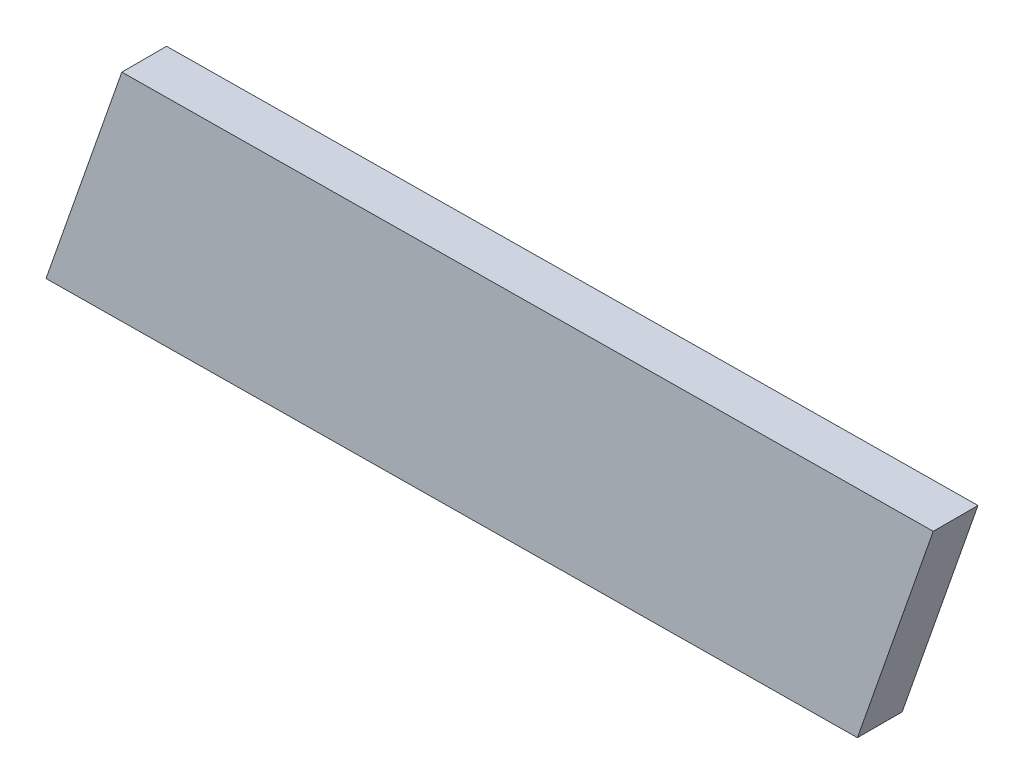
ISO-10303-21;
HEADER;
FILE_DESCRIPTION(('STEP AP214'),'2;1');
FILE_NAME('part.step','',(''),(''),'','','');
FILE_SCHEMA(('AUTOMOTIVE_DESIGN { 1 0 10303 214 1 1 1 1 }'));
ENDSEC;
DATA;
#1=APPLICATION_CONTEXT('core data for automotive mechanical design processes');
#2=APPLICATION_PROTOCOL_DEFINITION('international standard','automotive_design',2000,#1);
#3=PRODUCT_CONTEXT('',#1,'mechanical');
#4=PRODUCT('Part','Part','',(#3));
#5=PRODUCT_RELATED_PRODUCT_CATEGORY('part','',(#4));
#6=PRODUCT_DEFINITION_FORMATION('','',#4);
#7=PRODUCT_DEFINITION_CONTEXT('part definition',#1,'design');
#8=PRODUCT_DEFINITION('design','',#6,#7);
#9=PRODUCT_DEFINITION_SHAPE('','',#8);
#10=(LENGTH_UNIT() NAMED_UNIT(*) SI_UNIT(.MILLI.,.METRE.));
#11=(NAMED_UNIT(*) PLANE_ANGLE_UNIT() SI_UNIT($,.RADIAN.));
#12=(NAMED_UNIT(*) SI_UNIT($,.STERADIAN.) SOLID_ANGLE_UNIT());
#13=UNCERTAINTY_MEASURE_WITH_UNIT(LENGTH_MEASURE(1.E-05),#10,'distance_accuracy_value','');
#14=(GEOMETRIC_REPRESENTATION_CONTEXT(3) GLOBAL_UNCERTAINTY_ASSIGNED_CONTEXT((#13)) GLOBAL_UNIT_ASSIGNED_CONTEXT((#10,
#11,#12)) REPRESENTATION_CONTEXT('',''));
#15=CARTESIAN_POINT('',(0.,0.,0.));
#16=DIRECTION('',(0.,0.,1.));
#17=DIRECTION('',(1.,0.,0.));
#18=AXIS2_PLACEMENT_3D('',#15,#16,#17);
#19=CARTESIAN_POINT('',(-396.480550093671,-100.451262782976,-19.9253371305202));
#20=DIRECTION('',(0.,0.,1.));
#21=DIRECTION('',(1.,0.,0.));
#22=AXIS2_PLACEMENT_3D('',#19,#20,#21);
#23=PLANE('',#22);
#24=DIRECTION('',(0.,-1.,0.));
#25=VECTOR('',#24,1.);
#26=CARTESIAN_POINT('',(18.2047704018319,15.8676991552177,-19.9253371305202));
#27=LINE('',#26,#25);
#28=CARTESIAN_POINT('',(18.2047704018319,42.5285940980939,-19.9253371305202));
#29=VERTEX_POINT('',#28);
#30=CARTESIAN_POINT('',(18.2047704018319,15.8676991552177,-19.9253371305202));
#31=VERTEX_POINT('',#30);
#32=EDGE_CURVE('E234',#29,#31,#27,.T.);
#33=ORIENTED_EDGE('',*,*,#32,.F.);
#34=DIRECTION('',(1.,0.,0.));
#35=VECTOR('',#34,1.);
#36=CARTESIAN_POINT('',(18.2047704018319,42.5285940980939,-19.9253371305202));
#37=LINE('',#36,#35);
#38=CARTESIAN_POINT('',(-136.633504074103,42.5285940980939,-19.9253371305202));
#39=VERTEX_POINT('',#38);
#40=EDGE_CURVE('E224',#39,#29,#37,.T.);
#41=ORIENTED_EDGE('',*,*,#40,.F.);
#42=DIRECTION('',(0.,1.,0.));
#43=VECTOR('',#42,1.);
#44=CARTESIAN_POINT('',(-136.633504074103,15.8676991552177,-19.9253371305202));
#45=LINE('',#44,#43);
#46=CARTESIAN_POINT('',(-136.633504074103,15.8676991552177,-19.9253371305202));
#47=VERTEX_POINT('',#46);
#48=EDGE_CURVE('E227',#47,#39,#45,.T.);
#49=ORIENTED_EDGE('',*,*,#48,.F.);
#50=DIRECTION('',(-1.,0.,0.));
#51=VECTOR('',#50,1.);
#52=CARTESIAN_POINT('',(18.2047704018319,15.8676991552177,-19.9253371305202));
#53=LINE('',#52,#51);
#54=EDGE_CURVE('E231',#31,#47,#53,.T.);
#55=ORIENTED_EDGE('',*,*,#54,.F.);
#56=EDGE_LOOP('',(#33,#41,#49,#55));
#57=FACE_BOUND('',#56,.T.);
#58=DIRECTION('',(0.,-1.,0.));
#59=VECTOR('',#58,1.);
#60=CARTESIAN_POINT('',(478.617917684578,15.8676991552177,-19.9253371305202));
#61=LINE('',#60,#59);
#62=CARTESIAN_POINT('',(478.617917684578,42.5285940980939,-19.9253371305202));
#63=VERTEX_POINT('',#62);
#64=CARTESIAN_POINT('',(478.617917684578,15.8676991552177,-19.9253371305202));
#65=VERTEX_POINT('',#64);
#66=EDGE_CURVE('E270',#63,#65,#61,.T.);
#67=ORIENTED_EDGE('',*,*,#66,.F.);
#68=DIRECTION('',(1.,0.,0.));
#69=VECTOR('',#68,1.);
#70=CARTESIAN_POINT('',(478.617917684578,42.5285940980939,-19.9253371305202));
#71=LINE('',#70,#69);
#72=CARTESIAN_POINT('',(330.957576462495,42.5285940980939,-19.9253371305202));
#73=VERTEX_POINT('',#72);
#74=EDGE_CURVE('E282',#73,#63,#71,.T.);
#75=ORIENTED_EDGE('',*,*,#74,.F.);
#76=DIRECTION('',(0.,1.,0.));
#77=VECTOR('',#76,1.);
#78=CARTESIAN_POINT('',(330.957576462495,15.8676991552177,-19.9253371305202));
#79=LINE('',#78,#77);
#80=CARTESIAN_POINT('',(330.957576462495,15.8676991552177,-19.9253371305202));
#81=VERTEX_POINT('',#80);
#82=EDGE_CURVE('E294',#81,#73,#79,.T.);
#83=ORIENTED_EDGE('',*,*,#82,.F.);
#84=DIRECTION('',(-1.,0.,0.));
#85=VECTOR('',#84,1.);
#86=CARTESIAN_POINT('',(478.617917684578,15.8676991552177,-19.9253371305202));
#87=LINE('',#86,#85);
#88=EDGE_CURVE('E291',#65,#81,#87,.T.);
#89=ORIENTED_EDGE('',*,*,#88,.F.);
#90=EDGE_LOOP('',(#67,#75,#83,#89));
#91=FACE_BOUND('',#90,.T.);
#92=DIRECTION('',(0.999950891611865,0.00991031607147539,0.));
#93=VECTOR('',#92,1.);
#94=CARTESIAN_POINT('',(-396.480550093671,-100.451262782976,-19.9253371305202));
#95=LINE('',#94,#93);
#96=CARTESIAN_POINT('',(-396.480550093671,-100.451262782976,-19.9253371305202));
#97=VERTEX_POINT('',#96);
#98=CARTESIAN_POINT('',(510.183979551112,-91.4654894465558,-19.9253371305202));
#99=VERTEX_POINT('',#98);
#100=EDGE_CURVE('E310',#97,#99,#95,.T.);
#101=ORIENTED_EDGE('',*,*,#100,.F.);
#102=DIRECTION('',(-0.33029459913355,-0.943877893470976,0.));
#103=VECTOR('',#102,1.);
#104=CARTESIAN_POINT('',(-396.480550093671,-100.451262782976,-19.9253371305202));
#105=LINE('',#104,#103);
#106=CARTESIAN_POINT('',(-311.758231017663,141.658430409751,-19.9253371305202));
#107=VERTEX_POINT('',#106);
#108=EDGE_CURVE('E315',#107,#97,#105,.T.);
#109=ORIENTED_EDGE('',*,*,#108,.F.);
#110=DIRECTION('',(-0.999950891611865,-0.00991031607147539,0.));
#111=VECTOR('',#110,1.);
#112=CARTESIAN_POINT('',(-311.758231017663,141.658430409751,-19.9253371305202));
#113=LINE('',#112,#111);
#114=CARTESIAN_POINT('',(594.906298627121,150.644203746171,-19.9253371305202));
#115=VERTEX_POINT('',#114);
#116=EDGE_CURVE('E326',#115,#107,#113,.T.);
#117=ORIENTED_EDGE('',*,*,#116,.F.);
#118=DIRECTION('',(0.33029459913355,0.943877893470976,0.));
#119=VECTOR('',#118,1.);
#120=CARTESIAN_POINT('',(510.183979551112,-91.4654894465558,-19.9253371305202));
#121=LINE('',#120,#119);
#122=EDGE_CURVE('E324',#99,#115,#121,.T.);
#123=ORIENTED_EDGE('',*,*,#122,.F.);
#124=EDGE_LOOP('',(#101,#109,#117,#123));
#125=FACE_BOUND('',#124,.T.);
#126=DIRECTION('',(0.,-1.,0.));
#127=VECTOR('',#126,1.);
#128=CARTESIAN_POINT('',(246.873215488808,16.8931181914822,-19.9253371305202));
#129=LINE('',#128,#127);
#130=CARTESIAN_POINT('',(246.873215488808,43.5540131343584,-19.9253371305202));
#131=VERTEX_POINT('',#130);
#132=CARTESIAN_POINT('',(246.873215488808,16.8931181914822,-19.9253371305202));
#133=VERTEX_POINT('',#132);
#134=EDGE_CURVE('E267',#131,#133,#129,.T.);
#135=ORIENTED_EDGE('',*,*,#134,.F.);
#136=DIRECTION('',(1.,0.,0.));
#137=VECTOR('',#136,1.);
#138=CARTESIAN_POINT('',(246.873215488808,43.5540131343584,-19.9253371305202));
#139=LINE('',#138,#137);
#140=CARTESIAN_POINT('',(98.1874552304604,43.5540131343584,-19.9253371305202));
#141=VERTEX_POINT('',#140);
#142=EDGE_CURVE('E257',#141,#131,#139,.T.);
#143=ORIENTED_EDGE('',*,*,#142,.F.);
#144=DIRECTION('',(0.,1.,0.));
#145=VECTOR('',#144,1.);
#146=CARTESIAN_POINT('',(98.1874552304604,16.8931181914822,-19.9253371305202));
#147=LINE('',#146,#145);
#148=CARTESIAN_POINT('',(98.1874552304604,16.8931181914822,-19.9253371305202));
#149=VERTEX_POINT('',#148);
#150=EDGE_CURVE('E260',#149,#141,#147,.T.);
#151=ORIENTED_EDGE('',*,*,#150,.F.);
#152=DIRECTION('',(-1.,0.,0.));
#153=VECTOR('',#152,1.);
#154=CARTESIAN_POINT('',(246.873215488808,16.8931181914822,-19.9253371305202));
#155=LINE('',#154,#153);
#156=EDGE_CURVE('E264',#133,#149,#155,.T.);
#157=ORIENTED_EDGE('',*,*,#156,.F.);
#158=EDGE_LOOP('',(#135,#143,#151,#157));
#159=FACE_BOUND('',#158,.T.);
#160=DIRECTION('',(0.,-1.,0.));
#161=VECTOR('',#160,1.);
#162=CARTESIAN_POINT('',(-181.751941669739,16.8931181914822,-19.9253371305202));
#163=LINE('',#162,#161);
#164=CARTESIAN_POINT('',(-181.751941669739,43.5540131343584,-19.9253371305202));
#165=VERTEX_POINT('',#164);
#166=CARTESIAN_POINT('',(-181.751941669739,16.8931181914822,-19.9253371305202));
#167=VERTEX_POINT('',#166);
#168=EDGE_CURVE('E177',#165,#167,#163,.T.);
#169=ORIENTED_EDGE('',*,*,#168,.F.);
#170=DIRECTION('',(1.,0.,0.));
#171=VECTOR('',#170,1.);
#172=CARTESIAN_POINT('',(-181.751941669739,43.5540131343584,-19.9253371305202));
#173=LINE('',#172,#171);
#174=CARTESIAN_POINT('',(-316.081835420385,43.5540131343584,-19.9253371305202));
#175=VERTEX_POINT('',#174);
#176=EDGE_CURVE('E179',#175,#165,#173,.T.);
#177=ORIENTED_EDGE('',*,*,#176,.F.);
#178=DIRECTION('',(0.,1.,0.));
#179=VECTOR('',#178,1.);
#180=CARTESIAN_POINT('',(-316.081835420385,16.8931181914822,-19.9253371305202));
#181=LINE('',#180,#179);
#182=CARTESIAN_POINT('',(-316.081835420385,16.8931181914822,-19.9253371305202));
#183=VERTEX_POINT('',#182);
#184=EDGE_CURVE('E64',#183,#175,#181,.T.);
#185=ORIENTED_EDGE('',*,*,#184,.F.);
#186=DIRECTION('',(-1.,0.,0.));
#187=VECTOR('',#186,1.);
#188=CARTESIAN_POINT('',(-181.751941669739,16.8931181914822,-19.9253371305202));
#189=LINE('',#188,#187);
#190=EDGE_CURVE('E59',#167,#183,#189,.T.);
#191=ORIENTED_EDGE('',*,*,#190,.F.);
#192=EDGE_LOOP('',(#169,#177,#185,#191));
#193=FACE_BOUND('',#192,.T.);
#194=ADVANCED_FACE('F44',(#57,#91,#125,#159,#193),#23,.F.);
#195=CARTESIAN_POINT('',(-396.480550093671,-100.451262782976,30.0746628694798));
#196=DIRECTION('',(-0.00991031607147539,0.999950891611865,0.));
#197=DIRECTION('',(-0.999950891611865,-0.00991031607147539,0.));
#198=AXIS2_PLACEMENT_3D('',#195,#196,#197);
#199=PLANE('',#198);
#200=ORIENTED_EDGE('',*,*,#100,.T.);
#201=DIRECTION('',(0.,0.,-1.));
#202=VECTOR('',#201,1.);
#203=CARTESIAN_POINT('',(510.183979551112,-91.4654894465558,30.0746628694798));
#204=LINE('',#203,#202);
#205=CARTESIAN_POINT('',(510.183979551112,-91.4654894465558,30.0746628694798));
#206=VERTEX_POINT('',#205);
#207=EDGE_CURVE('E11',#206,#99,#204,.T.);
#208=ORIENTED_EDGE('',*,*,#207,.F.);
#209=DIRECTION('',(0.999950891611865,0.00991031607147539,0.));
#210=VECTOR('',#209,1.);
#211=CARTESIAN_POINT('',(-396.480550093671,-100.451262782976,30.0746628694798));
#212=LINE('',#211,#210);
#213=CARTESIAN_POINT('',(-396.480550093671,-100.451262782976,30.0746628694798));
#214=VERTEX_POINT('',#213);
#215=EDGE_CURVE('E311',#214,#206,#212,.T.);
#216=ORIENTED_EDGE('',*,*,#215,.F.);
#217=DIRECTION('',(0.,0.,-1.));
#218=VECTOR('',#217,1.);
#219=CARTESIAN_POINT('',(-396.480550093671,-100.451262782976,30.0746628694798));
#220=LINE('',#219,#218);
#221=EDGE_CURVE('E321',#214,#97,#220,.T.);
#222=ORIENTED_EDGE('',*,*,#221,.T.);
#223=EDGE_LOOP('',(#200,#208,#216,#222));
#224=FACE_BOUND('',#223,.T.);
#225=ADVANCED_FACE('F46',(#224),#199,.F.);
#226=CARTESIAN_POINT('',(510.183979551112,-91.4654894465558,30.0746628694798));
#227=DIRECTION('',(-0.943877893470976,0.33029459913355,0.));
#228=DIRECTION('',(-0.33029459913355,-0.943877893470977,0.));
#229=AXIS2_PLACEMENT_3D('',#226,#227,#228);
#230=PLANE('',#229);
#231=ORIENTED_EDGE('',*,*,#122,.T.);
#232=DIRECTION('',(0.,0.,-1.));
#233=VECTOR('',#232,1.);
#234=CARTESIAN_POINT('',(594.906298627121,150.644203746171,30.0746628694798));
#235=LINE('',#234,#233);
#236=CARTESIAN_POINT('',(594.906298627121,150.644203746171,30.0746628694798));
#237=VERTEX_POINT('',#236);
#238=EDGE_CURVE('E52',#237,#115,#235,.T.);
#239=ORIENTED_EDGE('',*,*,#238,.F.);
#240=DIRECTION('',(0.33029459913355,0.943877893470976,0.));
#241=VECTOR('',#240,1.);
#242=CARTESIAN_POINT('',(510.183979551112,-91.4654894465558,30.0746628694798));
#243=LINE('',#242,#241);
#244=EDGE_CURVE('E314',#206,#237,#243,.T.);
#245=ORIENTED_EDGE('',*,*,#244,.F.);
#246=ORIENTED_EDGE('',*,*,#207,.T.);
#247=EDGE_LOOP('',(#231,#239,#245,#246));
#248=FACE_BOUND('',#247,.T.);
#249=ADVANCED_FACE('F354',(#248),#230,.F.);
#250=CARTESIAN_POINT('',(-311.758231017663,141.658430409751,30.0746628694798));
#251=DIRECTION('',(0.00991031607147539,-0.999950891611865,0.));
#252=DIRECTION('',(0.999950891611865,0.00991031607147539,0.));
#253=AXIS2_PLACEMENT_3D('',#250,#251,#252);
#254=PLANE('',#253);
#255=ORIENTED_EDGE('',*,*,#116,.T.);
#256=DIRECTION('',(0.,0.,-1.));
#257=VECTOR('',#256,1.);
#258=CARTESIAN_POINT('',(-311.758231017663,141.658430409751,30.0746628694798));
#259=LINE('',#258,#257);
#260=CARTESIAN_POINT('',(-311.758231017663,141.658430409751,30.0746628694798));
#261=VERTEX_POINT('',#260);
#262=EDGE_CURVE('E331',#261,#107,#259,.T.);
#263=ORIENTED_EDGE('',*,*,#262,.F.);
#264=DIRECTION('',(-0.999950891611865,-0.00991031607147539,0.));
#265=VECTOR('',#264,1.);
#266=CARTESIAN_POINT('',(-311.758231017663,141.658430409751,30.0746628694798));
#267=LINE('',#266,#265);
#268=EDGE_CURVE('E317',#237,#261,#267,.T.);
#269=ORIENTED_EDGE('',*,*,#268,.F.);
#270=ORIENTED_EDGE('',*,*,#238,.T.);
#271=EDGE_LOOP('',(#255,#263,#269,#270));
#272=FACE_BOUND('',#271,.T.);
#273=ADVANCED_FACE('F338',(#272),#254,.F.);
#274=CARTESIAN_POINT('',(-396.480550093671,-100.451262782976,30.0746628694798));
#275=DIRECTION('',(0.943877893470976,-0.33029459913355,0.));
#276=DIRECTION('',(0.33029459913355,0.943877893470977,0.));
#277=AXIS2_PLACEMENT_3D('',#274,#275,#276);
#278=PLANE('',#277);
#279=ORIENTED_EDGE('',*,*,#108,.T.);
#280=ORIENTED_EDGE('',*,*,#221,.F.);
#281=DIRECTION('',(-0.33029459913355,-0.943877893470976,0.));
#282=VECTOR('',#281,1.);
#283=CARTESIAN_POINT('',(-396.480550093671,-100.451262782976,30.0746628694798));
#284=LINE('',#283,#282);
#285=EDGE_CURVE('E319',#261,#214,#284,.T.);
#286=ORIENTED_EDGE('',*,*,#285,.F.);
#287=ORIENTED_EDGE('',*,*,#262,.T.);
#288=EDGE_LOOP('',(#279,#280,#286,#287));
#289=FACE_BOUND('',#288,.T.);
#290=ADVANCED_FACE('F347',(#289),#278,.F.);
#291=CARTESIAN_POINT('',(-396.480550093671,-100.451262782976,30.0746628694798));
#292=DIRECTION('',(0.,0.,1.));
#293=DIRECTION('',(1.,0.,0.));
#294=AXIS2_PLACEMENT_3D('',#291,#292,#293);
#295=PLANE('',#294);
#296=ORIENTED_EDGE('',*,*,#215,.T.);
#297=ORIENTED_EDGE('',*,*,#244,.T.);
#298=ORIENTED_EDGE('',*,*,#268,.T.);
#299=ORIENTED_EDGE('',*,*,#285,.T.);
#300=EDGE_LOOP('',(#296,#297,#298,#299));
#301=FACE_BOUND('',#300,.T.);
#302=ADVANCED_FACE('F353',(#301),#295,.T.);
#303=CARTESIAN_POINT('',(478.617917684578,15.8676991552177,-22.4253371305202));
#304=DIRECTION('',(-1.,0.,0.));
#305=DIRECTION('',(0.,0.,1.));
#306=AXIS2_PLACEMENT_3D('',#303,#304,#305);
#307=PLANE('',#306);
#308=ORIENTED_EDGE('',*,*,#66,.T.);
#309=DIRECTION('',(0.,0.,1.));
#310=VECTOR('',#309,1.);
#311=CARTESIAN_POINT('',(478.617917684578,15.8676991552177,-22.4253371305202));
#312=LINE('',#311,#310);
#313=CARTESIAN_POINT('',(478.617917684578,15.8676991552177,-22.4253371305202));
#314=VERTEX_POINT('',#313);
#315=EDGE_CURVE('E307',#314,#65,#312,.T.);
#316=ORIENTED_EDGE('',*,*,#315,.F.);
#317=DIRECTION('',(0.,-1.,0.));
#318=VECTOR('',#317,1.);
#319=CARTESIAN_POINT('',(478.617917684578,15.8676991552177,-22.4253371305202));
#320=LINE('',#319,#318);
#321=CARTESIAN_POINT('',(478.617917684578,42.5285940980939,-22.4253371305202));
#322=VERTEX_POINT('',#321);
#323=EDGE_CURVE('E278',#322,#314,#320,.T.);
#324=ORIENTED_EDGE('',*,*,#323,.F.);
#325=DIRECTION('',(0.,0.,1.));
#326=VECTOR('',#325,1.);
#327=CARTESIAN_POINT('',(478.617917684578,42.5285940980939,-22.4253371305202));
#328=LINE('',#327,#326);
#329=EDGE_CURVE('E288',#322,#63,#328,.T.);
#330=ORIENTED_EDGE('',*,*,#329,.T.);
#331=EDGE_LOOP('',(#308,#316,#324,#330));
#332=FACE_BOUND('',#331,.T.);
#333=ADVANCED_FACE('F374',(#332),#307,.F.);
#334=CARTESIAN_POINT('',(478.617917684578,15.8676991552177,-22.4253371305202));
#335=DIRECTION('',(0.,1.,0.));
#336=DIRECTION('',(0.,0.,1.));
#337=AXIS2_PLACEMENT_3D('',#334,#335,#336);
#338=PLANE('',#337);
#339=ORIENTED_EDGE('',*,*,#88,.T.);
#340=DIRECTION('',(0.,0.,1.));
#341=VECTOR('',#340,1.);
#342=CARTESIAN_POINT('',(330.957576462495,15.8676991552177,-22.4253371305202));
#343=LINE('',#342,#341);
#344=CARTESIAN_POINT('',(330.957576462495,15.8676991552177,-22.4253371305202));
#345=VERTEX_POINT('',#344);
#346=EDGE_CURVE('E304',#345,#81,#343,.T.);
#347=ORIENTED_EDGE('',*,*,#346,.F.);
#348=DIRECTION('',(-1.,0.,0.));
#349=VECTOR('',#348,1.);
#350=CARTESIAN_POINT('',(478.617917684578,15.8676991552177,-22.4253371305202));
#351=LINE('',#350,#349);
#352=EDGE_CURVE('E281',#314,#345,#351,.T.);
#353=ORIENTED_EDGE('',*,*,#352,.F.);
#354=ORIENTED_EDGE('',*,*,#315,.T.);
#355=EDGE_LOOP('',(#339,#347,#353,#354));
#356=FACE_BOUND('',#355,.T.);
#357=ADVANCED_FACE('F378',(#356),#338,.F.);
#358=CARTESIAN_POINT('',(330.957576462495,15.8676991552177,-22.4253371305202));
#359=DIRECTION('',(1.,0.,0.));
#360=DIRECTION('',(0.,0.,-1.));
#361=AXIS2_PLACEMENT_3D('',#358,#359,#360);
#362=PLANE('',#361);
#363=ORIENTED_EDGE('',*,*,#82,.T.);
#364=DIRECTION('',(0.,0.,1.));
#365=VECTOR('',#364,1.);
#366=CARTESIAN_POINT('',(330.957576462495,42.5285940980939,-22.4253371305202));
#367=LINE('',#366,#365);
#368=CARTESIAN_POINT('',(330.957576462495,42.5285940980939,-22.4253371305202));
#369=VERTEX_POINT('',#368);
#370=EDGE_CURVE('E301',#369,#73,#367,.T.);
#371=ORIENTED_EDGE('',*,*,#370,.F.);
#372=DIRECTION('',(0.,1.,0.));
#373=VECTOR('',#372,1.);
#374=CARTESIAN_POINT('',(330.957576462495,15.8676991552177,-22.4253371305202));
#375=LINE('',#374,#373);
#376=EDGE_CURVE('E284',#345,#369,#375,.T.);
#377=ORIENTED_EDGE('',*,*,#376,.F.);
#378=ORIENTED_EDGE('',*,*,#346,.T.);
#379=EDGE_LOOP('',(#363,#371,#377,#378));
#380=FACE_BOUND('',#379,.T.);
#381=ADVANCED_FACE('F384',(#380),#362,.F.);
#382=CARTESIAN_POINT('',(478.617917684578,42.5285940980939,-22.4253371305202));
#383=DIRECTION('',(0.,-1.,0.));
#384=DIRECTION('',(0.,0.,-1.));
#385=AXIS2_PLACEMENT_3D('',#382,#383,#384);
#386=PLANE('',#385);
#387=ORIENTED_EDGE('',*,*,#74,.T.);
#388=ORIENTED_EDGE('',*,*,#329,.F.);
#389=DIRECTION('',(1.,0.,0.));
#390=VECTOR('',#389,1.);
#391=CARTESIAN_POINT('',(478.617917684578,42.5285940980939,-22.4253371305202));
#392=LINE('',#391,#390);
#393=EDGE_CURVE('E286',#369,#322,#392,.T.);
#394=ORIENTED_EDGE('',*,*,#393,.F.);
#395=ORIENTED_EDGE('',*,*,#370,.T.);
#396=EDGE_LOOP('',(#387,#388,#394,#395));
#397=FACE_BOUND('',#396,.T.);
#398=ADVANCED_FACE('F390',(#397),#386,.F.);
#399=CARTESIAN_POINT('',(-396.480550093671,-100.451262782976,-22.4253371305202));
#400=DIRECTION('',(0.,0.,1.));
#401=DIRECTION('',(1.,0.,0.));
#402=AXIS2_PLACEMENT_3D('',#399,#400,#401);
#403=PLANE('',#402);
#404=ORIENTED_EDGE('',*,*,#323,.T.);
#405=ORIENTED_EDGE('',*,*,#352,.T.);
#406=ORIENTED_EDGE('',*,*,#376,.T.);
#407=ORIENTED_EDGE('',*,*,#393,.T.);
#408=EDGE_LOOP('',(#404,#405,#406,#407));
#409=FACE_BOUND('',#408,.T.);
#410=ADVANCED_FACE('F394',(#409),#403,.F.);
#411=CARTESIAN_POINT('',(246.873215488808,16.8931181914822,-22.4253371305202));
#412=DIRECTION('',(-1.,0.,0.));
#413=DIRECTION('',(0.,0.,1.));
#414=AXIS2_PLACEMENT_3D('',#411,#412,#413);
#415=PLANE('',#414);
#416=ORIENTED_EDGE('',*,*,#134,.T.);
#417=DIRECTION('',(0.,0.,1.));
#418=VECTOR('',#417,1.);
#419=CARTESIAN_POINT('',(246.873215488808,16.8931181914822,-22.4253371305202));
#420=LINE('',#419,#418);
#421=CARTESIAN_POINT('',(246.873215488808,16.8931181914822,-22.4253371305202));
#422=VERTEX_POINT('',#421);
#423=EDGE_CURVE('E237',#422,#133,#420,.T.);
#424=ORIENTED_EDGE('',*,*,#423,.F.);
#425=DIRECTION('',(0.,-1.,0.));
#426=VECTOR('',#425,1.);
#427=CARTESIAN_POINT('',(246.873215488808,16.8931181914822,-22.4253371305202));
#428=LINE('',#427,#426);
#429=CARTESIAN_POINT('',(246.873215488808,43.5540131343584,-22.4253371305202));
#430=VERTEX_POINT('',#429);
#431=EDGE_CURVE('E261',#430,#422,#428,.T.);
#432=ORIENTED_EDGE('',*,*,#431,.F.);
#433=DIRECTION('',(0.,0.,1.));
#434=VECTOR('',#433,1.);
#435=CARTESIAN_POINT('',(246.873215488808,43.5540131343584,-22.4253371305202));
#436=LINE('',#435,#434);
#437=EDGE_CURVE('E253',#430,#131,#436,.T.);
#438=ORIENTED_EDGE('',*,*,#437,.T.);
#439=EDGE_LOOP('',(#416,#424,#432,#438));
#440=FACE_BOUND('',#439,.T.);
#441=ADVANCED_FACE('F398',(#440),#415,.F.);
#442=CARTESIAN_POINT('',(246.873215488808,16.8931181914822,-22.4253371305202));
#443=DIRECTION('',(0.,1.,0.));
#444=DIRECTION('',(0.,0.,1.));
#445=AXIS2_PLACEMENT_3D('',#442,#443,#444);
#446=PLANE('',#445);
#447=ORIENTED_EDGE('',*,*,#156,.T.);
#448=DIRECTION('',(0.,0.,1.));
#449=VECTOR('',#448,1.);
#450=CARTESIAN_POINT('',(98.1874552304604,16.8931181914822,-22.4253371305202));
#451=LINE('',#450,#449);
#452=CARTESIAN_POINT('',(98.1874552304604,16.8931181914822,-22.4253371305202));
#453=VERTEX_POINT('',#452);
#454=EDGE_CURVE('E247',#453,#149,#451,.T.);
#455=ORIENTED_EDGE('',*,*,#454,.F.);
#456=DIRECTION('',(-1.,0.,0.));
#457=VECTOR('',#456,1.);
#458=CARTESIAN_POINT('',(246.873215488808,16.8931181914822,-22.4253371305202));
#459=LINE('',#458,#457);
#460=EDGE_CURVE('E274',#422,#453,#459,.T.);
#461=ORIENTED_EDGE('',*,*,#460,.F.);
#462=ORIENTED_EDGE('',*,*,#423,.T.);
#463=EDGE_LOOP('',(#447,#455,#461,#462));
#464=FACE_BOUND('',#463,.T.);
#465=ADVANCED_FACE('F412',(#464),#446,.F.);
#466=CARTESIAN_POINT('',(98.1874552304604,16.8931181914822,-22.4253371305202));
#467=DIRECTION('',(1.,0.,0.));
#468=DIRECTION('',(0.,0.,-1.));
#469=AXIS2_PLACEMENT_3D('',#466,#467,#468);
#470=PLANE('',#469);
#471=ORIENTED_EDGE('',*,*,#150,.T.);
#472=DIRECTION('',(0.,0.,1.));
#473=VECTOR('',#472,1.);
#474=CARTESIAN_POINT('',(98.1874552304604,43.5540131343584,-22.4253371305202));
#475=LINE('',#474,#473);
#476=CARTESIAN_POINT('',(98.1874552304604,43.5540131343584,-22.4253371305202));
#477=VERTEX_POINT('',#476);
#478=EDGE_CURVE('E250',#477,#141,#475,.T.);
#479=ORIENTED_EDGE('',*,*,#478,.F.);
#480=DIRECTION('',(0.,1.,0.));
#481=VECTOR('',#480,1.);
#482=CARTESIAN_POINT('',(98.1874552304604,16.8931181914822,-22.4253371305202));
#483=LINE('',#482,#481);
#484=EDGE_CURVE('E272',#453,#477,#483,.T.);
#485=ORIENTED_EDGE('',*,*,#484,.F.);
#486=ORIENTED_EDGE('',*,*,#454,.T.);
#487=EDGE_LOOP('',(#471,#479,#485,#486));
#488=FACE_BOUND('',#487,.T.);
#489=ADVANCED_FACE('F408',(#488),#470,.F.);
#490=CARTESIAN_POINT('',(246.873215488808,43.5540131343584,-22.4253371305202));
#491=DIRECTION('',(0.,-1.,0.));
#492=DIRECTION('',(0.,0.,-1.));
#493=AXIS2_PLACEMENT_3D('',#490,#491,#492);
#494=PLANE('',#493);
#495=ORIENTED_EDGE('',*,*,#142,.T.);
#496=ORIENTED_EDGE('',*,*,#437,.F.);
#497=DIRECTION('',(1.,0.,0.));
#498=VECTOR('',#497,1.);
#499=CARTESIAN_POINT('',(246.873215488808,43.5540131343584,-22.4253371305202));
#500=LINE('',#499,#498);
#501=EDGE_CURVE('E256',#477,#430,#500,.T.);
#502=ORIENTED_EDGE('',*,*,#501,.F.);
#503=ORIENTED_EDGE('',*,*,#478,.T.);
#504=EDGE_LOOP('',(#495,#496,#502,#503));
#505=FACE_BOUND('',#504,.T.);
#506=ADVANCED_FACE('F404',(#505),#494,.F.);
#507=CARTESIAN_POINT('',(-396.480550093671,-100.451262782976,-22.4253371305202));
#508=DIRECTION('',(0.,0.,1.));
#509=DIRECTION('',(1.,0.,0.));
#510=AXIS2_PLACEMENT_3D('',#507,#508,#509);
#511=PLANE('',#510);
#512=ORIENTED_EDGE('',*,*,#431,.T.);
#513=ORIENTED_EDGE('',*,*,#460,.T.);
#514=ORIENTED_EDGE('',*,*,#484,.T.);
#515=ORIENTED_EDGE('',*,*,#501,.T.);
#516=EDGE_LOOP('',(#512,#513,#514,#515));
#517=FACE_BOUND('',#516,.T.);
#518=ADVANCED_FACE('F400',(#517),#511,.F.);
#519=CARTESIAN_POINT('',(18.2047704018319,15.8676991552177,-22.4253371305202));
#520=DIRECTION('',(-1.,0.,0.));
#521=DIRECTION('',(0.,0.,1.));
#522=AXIS2_PLACEMENT_3D('',#519,#520,#521);
#523=PLANE('',#522);
#524=ORIENTED_EDGE('',*,*,#32,.T.);
#525=DIRECTION('',(0.,0.,1.));
#526=VECTOR('',#525,1.);
#527=CARTESIAN_POINT('',(18.2047704018319,15.8676991552177,-22.4253371305202));
#528=LINE('',#527,#526);
#529=CARTESIAN_POINT('',(18.2047704018319,15.8676991552177,-22.4253371305202));
#530=VERTEX_POINT('',#529);
#531=EDGE_CURVE('E183',#530,#31,#528,.T.);
#532=ORIENTED_EDGE('',*,*,#531,.F.);
#533=DIRECTION('',(0.,-1.,0.));
#534=VECTOR('',#533,1.);
#535=CARTESIAN_POINT('',(18.2047704018319,15.8676991552177,-22.4253371305202));
#536=LINE('',#535,#534);
#537=CARTESIAN_POINT('',(18.2047704018319,42.5285940980939,-22.4253371305202));
#538=VERTEX_POINT('',#537);
#539=EDGE_CURVE('E228',#538,#530,#536,.T.);
#540=ORIENTED_EDGE('',*,*,#539,.F.);
#541=DIRECTION('',(0.,0.,1.));
#542=VECTOR('',#541,1.);
#543=CARTESIAN_POINT('',(18.2047704018319,42.5285940980939,-22.4253371305202));
#544=LINE('',#543,#542);
#545=EDGE_CURVE('E220',#538,#29,#544,.T.);
#546=ORIENTED_EDGE('',*,*,#545,.T.);
#547=EDGE_LOOP('',(#524,#532,#540,#546));
#548=FACE_BOUND('',#547,.T.);
#549=ADVANCED_FACE('F403',(#548),#523,.F.);
#550=CARTESIAN_POINT('',(18.2047704018319,15.8676991552177,-22.4253371305202));
#551=DIRECTION('',(0.,1.,0.));
#552=DIRECTION('',(0.,0.,1.));
#553=AXIS2_PLACEMENT_3D('',#550,#551,#552);
#554=PLANE('',#553);
#555=ORIENTED_EDGE('',*,*,#54,.T.);
#556=DIRECTION('',(0.,0.,1.));
#557=VECTOR('',#556,1.);
#558=CARTESIAN_POINT('',(-136.633504074103,15.8676991552177,-22.4253371305202));
#559=LINE('',#558,#557);
#560=CARTESIAN_POINT('',(-136.633504074103,15.8676991552177,-22.4253371305202));
#561=VERTEX_POINT('',#560);
#562=EDGE_CURVE('E214',#561,#47,#559,.T.);
#563=ORIENTED_EDGE('',*,*,#562,.F.);
#564=DIRECTION('',(-1.,0.,0.));
#565=VECTOR('',#564,1.);
#566=CARTESIAN_POINT('',(18.2047704018319,15.8676991552177,-22.4253371305202));
#567=LINE('',#566,#565);
#568=EDGE_CURVE('E241',#530,#561,#567,.T.);
#569=ORIENTED_EDGE('',*,*,#568,.F.);
#570=ORIENTED_EDGE('',*,*,#531,.T.);
#571=EDGE_LOOP('',(#555,#563,#569,#570));
#572=FACE_BOUND('',#571,.T.);
#573=ADVANCED_FACE('F431',(#572),#554,.F.);
#574=CARTESIAN_POINT('',(-136.633504074103,15.8676991552177,-22.4253371305202));
#575=DIRECTION('',(1.,0.,0.));
#576=DIRECTION('',(0.,0.,-1.));
#577=AXIS2_PLACEMENT_3D('',#574,#575,#576);
#578=PLANE('',#577);
#579=ORIENTED_EDGE('',*,*,#48,.T.);
#580=DIRECTION('',(0.,0.,1.));
#581=VECTOR('',#580,1.);
#582=CARTESIAN_POINT('',(-136.633504074103,42.5285940980939,-22.4253371305202));
#583=LINE('',#582,#581);
#584=CARTESIAN_POINT('',(-136.633504074103,42.5285940980939,-22.4253371305202));
#585=VERTEX_POINT('',#584);
#586=EDGE_CURVE('E217',#585,#39,#583,.T.);
#587=ORIENTED_EDGE('',*,*,#586,.F.);
#588=DIRECTION('',(0.,1.,0.));
#589=VECTOR('',#588,1.);
#590=CARTESIAN_POINT('',(-136.633504074103,15.8676991552177,-22.4253371305202));
#591=LINE('',#590,#589);
#592=EDGE_CURVE('E239',#561,#585,#591,.T.);
#593=ORIENTED_EDGE('',*,*,#592,.F.);
#594=ORIENTED_EDGE('',*,*,#562,.T.);
#595=EDGE_LOOP('',(#579,#587,#593,#594));
#596=FACE_BOUND('',#595,.T.);
#597=ADVANCED_FACE('F427',(#596),#578,.F.);
#598=CARTESIAN_POINT('',(18.2047704018319,42.5285940980939,-22.4253371305202));
#599=DIRECTION('',(0.,-1.,0.));
#600=DIRECTION('',(0.,0.,-1.));
#601=AXIS2_PLACEMENT_3D('',#598,#599,#600);
#602=PLANE('',#601);
#603=ORIENTED_EDGE('',*,*,#40,.T.);
#604=ORIENTED_EDGE('',*,*,#545,.F.);
#605=DIRECTION('',(1.,0.,0.));
#606=VECTOR('',#605,1.);
#607=CARTESIAN_POINT('',(18.2047704018319,42.5285940980939,-22.4253371305202));
#608=LINE('',#607,#606);
#609=EDGE_CURVE('E223',#585,#538,#608,.T.);
#610=ORIENTED_EDGE('',*,*,#609,.F.);
#611=ORIENTED_EDGE('',*,*,#586,.T.);
#612=EDGE_LOOP('',(#603,#604,#610,#611));
#613=FACE_BOUND('',#612,.T.);
#614=ADVANCED_FACE('F423',(#613),#602,.F.);
#615=CARTESIAN_POINT('',(-396.480550093671,-100.451262782976,-22.4253371305202));
#616=DIRECTION('',(0.,0.,1.));
#617=DIRECTION('',(1.,0.,0.));
#618=AXIS2_PLACEMENT_3D('',#615,#616,#617);
#619=PLANE('',#618);
#620=ORIENTED_EDGE('',*,*,#539,.T.);
#621=ORIENTED_EDGE('',*,*,#568,.T.);
#622=ORIENTED_EDGE('',*,*,#592,.T.);
#623=ORIENTED_EDGE('',*,*,#609,.T.);
#624=EDGE_LOOP('',(#620,#621,#622,#623));
#625=FACE_BOUND('',#624,.T.);
#626=ADVANCED_FACE('F420',(#625),#619,.F.);
#627=CARTESIAN_POINT('',(-181.751941669739,16.8931181914822,-22.4253371305202));
#628=DIRECTION('',(-1.,0.,0.));
#629=DIRECTION('',(0.,0.,1.));
#630=AXIS2_PLACEMENT_3D('',#627,#628,#629);
#631=PLANE('',#630);
#632=ORIENTED_EDGE('',*,*,#168,.T.);
#633=DIRECTION('',(0.,0.,1.));
#634=VECTOR('',#633,1.);
#635=CARTESIAN_POINT('',(-181.751941669739,16.8931181914822,-22.4253371305202));
#636=LINE('',#635,#634);
#637=CARTESIAN_POINT('',(-181.751941669739,16.8931181914822,-22.4253371305202));
#638=VERTEX_POINT('',#637);
#639=EDGE_CURVE('E626',#638,#167,#636,.T.);
#640=ORIENTED_EDGE('',*,*,#639,.F.);
#641=DIRECTION('',(0.,-1.,0.));
#642=VECTOR('',#641,1.);
#643=CARTESIAN_POINT('',(-181.751941669739,16.8931181914822,-22.4253371305202));
#644=LINE('',#643,#642);
#645=CARTESIAN_POINT('',(-181.751941669739,43.5540131343584,-22.4253371305202));
#646=VERTEX_POINT('',#645);
#647=EDGE_CURVE('E194',#646,#638,#644,.T.);
#648=ORIENTED_EDGE('',*,*,#647,.F.);
#649=DIRECTION('',(0.,0.,1.));
#650=VECTOR('',#649,1.);
#651=CARTESIAN_POINT('',(-181.751941669739,43.5540131343584,-22.4253371305202));
#652=LINE('',#651,#650);
#653=EDGE_CURVE('E190',#646,#165,#652,.T.);
#654=ORIENTED_EDGE('',*,*,#653,.T.);
#655=EDGE_LOOP('',(#632,#640,#648,#654));
#656=FACE_BOUND('',#655,.T.);
#657=ADVANCED_FACE('F196',(#656),#631,.F.);
#658=CARTESIAN_POINT('',(-181.751941669739,16.8931181914822,-22.4253371305202));
#659=DIRECTION('',(0.,1.,0.));
#660=DIRECTION('',(0.,0.,1.));
#661=AXIS2_PLACEMENT_3D('',#658,#659,#660);
#662=PLANE('',#661);
#663=ORIENTED_EDGE('',*,*,#190,.T.);
#664=DIRECTION('',(0.,0.,1.));
#665=VECTOR('',#664,1.);
#666=CARTESIAN_POINT('',(-316.081835420385,16.8931181914822,-22.4253371305202));
#667=LINE('',#666,#665);
#668=CARTESIAN_POINT('',(-316.081835420385,16.8931181914822,-22.4253371305202));
#669=VERTEX_POINT('',#668);
#670=EDGE_CURVE('E202',#669,#183,#667,.T.);
#671=ORIENTED_EDGE('',*,*,#670,.F.);
#672=DIRECTION('',(-1.,0.,0.));
#673=VECTOR('',#672,1.);
#674=CARTESIAN_POINT('',(-181.751941669739,16.8931181914822,-22.4253371305202));
#675=LINE('',#674,#673);
#676=EDGE_CURVE('E209',#638,#669,#675,.T.);
#677=ORIENTED_EDGE('',*,*,#676,.F.);
#678=ORIENTED_EDGE('',*,*,#639,.T.);
#679=EDGE_LOOP('',(#663,#671,#677,#678));
#680=FACE_BOUND('',#679,.T.);
#681=ADVANCED_FACE('F448',(#680),#662,.F.);
#682=CARTESIAN_POINT('',(-316.081835420385,16.8931181914822,-22.4253371305202));
#683=DIRECTION('',(1.,0.,0.));
#684=DIRECTION('',(0.,0.,-1.));
#685=AXIS2_PLACEMENT_3D('',#682,#683,#684);
#686=PLANE('',#685);
#687=ORIENTED_EDGE('',*,*,#184,.T.);
#688=DIRECTION('',(0.,0.,1.));
#689=VECTOR('',#688,1.);
#690=CARTESIAN_POINT('',(-316.081835420385,43.5540131343584,-22.4253371305202));
#691=LINE('',#690,#689);
#692=CARTESIAN_POINT('',(-316.081835420385,43.5540131343584,-22.4253371305202));
#693=VERTEX_POINT('',#692);
#694=EDGE_CURVE('E193',#693,#175,#691,.T.);
#695=ORIENTED_EDGE('',*,*,#694,.F.);
#696=DIRECTION('',(0.,1.,0.));
#697=VECTOR('',#696,1.);
#698=CARTESIAN_POINT('',(-316.081835420385,16.8931181914822,-22.4253371305202));
#699=LINE('',#698,#697);
#700=EDGE_CURVE('E200',#669,#693,#699,.T.);
#701=ORIENTED_EDGE('',*,*,#700,.F.);
#702=ORIENTED_EDGE('',*,*,#670,.T.);
#703=EDGE_LOOP('',(#687,#695,#701,#702));
#704=FACE_BOUND('',#703,.T.);
#705=ADVANCED_FACE('F445',(#704),#686,.F.);
#706=CARTESIAN_POINT('',(-181.751941669739,43.5540131343584,-22.4253371305202));
#707=DIRECTION('',(0.,-1.,0.));
#708=DIRECTION('',(0.,0.,-1.));
#709=AXIS2_PLACEMENT_3D('',#706,#707,#708);
#710=PLANE('',#709);
#711=ORIENTED_EDGE('',*,*,#176,.T.);
#712=ORIENTED_EDGE('',*,*,#653,.F.);
#713=DIRECTION('',(1.,0.,0.));
#714=VECTOR('',#713,1.);
#715=CARTESIAN_POINT('',(-181.751941669739,43.5540131343584,-22.4253371305202));
#716=LINE('',#715,#714);
#717=EDGE_CURVE('E198',#693,#646,#716,.T.);
#718=ORIENTED_EDGE('',*,*,#717,.F.);
#719=ORIENTED_EDGE('',*,*,#694,.T.);
#720=EDGE_LOOP('',(#711,#712,#718,#719));
#721=FACE_BOUND('',#720,.T.);
#722=ADVANCED_FACE('F188',(#721),#710,.F.);
#723=CARTESIAN_POINT('',(-396.480550093671,-100.451262782976,-22.4253371305202));
#724=DIRECTION('',(0.,0.,1.));
#725=DIRECTION('',(1.,0.,0.));
#726=AXIS2_PLACEMENT_3D('',#723,#724,#725);
#727=PLANE('',#726);
#728=ORIENTED_EDGE('',*,*,#647,.T.);
#729=ORIENTED_EDGE('',*,*,#676,.T.);
#730=ORIENTED_EDGE('',*,*,#700,.T.);
#731=ORIENTED_EDGE('',*,*,#717,.T.);
#732=EDGE_LOOP('',(#728,#729,#730,#731));
#733=FACE_BOUND('',#732,.T.);
#734=ADVANCED_FACE('F439',(#733),#727,.F.);
#735=CLOSED_SHELL('',(#194,#225,#249,#273,#290,#302,#333,#357,#381,#398,#410,#441,#465,#489,
#506,#518,#549,#573,#597,#614,#626,#657,#681,#705,#722,#734));
#736=MANIFOLD_SOLID_BREP('B2',#735);
#737=ADVANCED_BREP_SHAPE_REPRESENTATION('',(#18,#736),#14);
#738=SHAPE_DEFINITION_REPRESENTATION(#9,#737);
ENDSEC;
END-ISO-10303-21;
